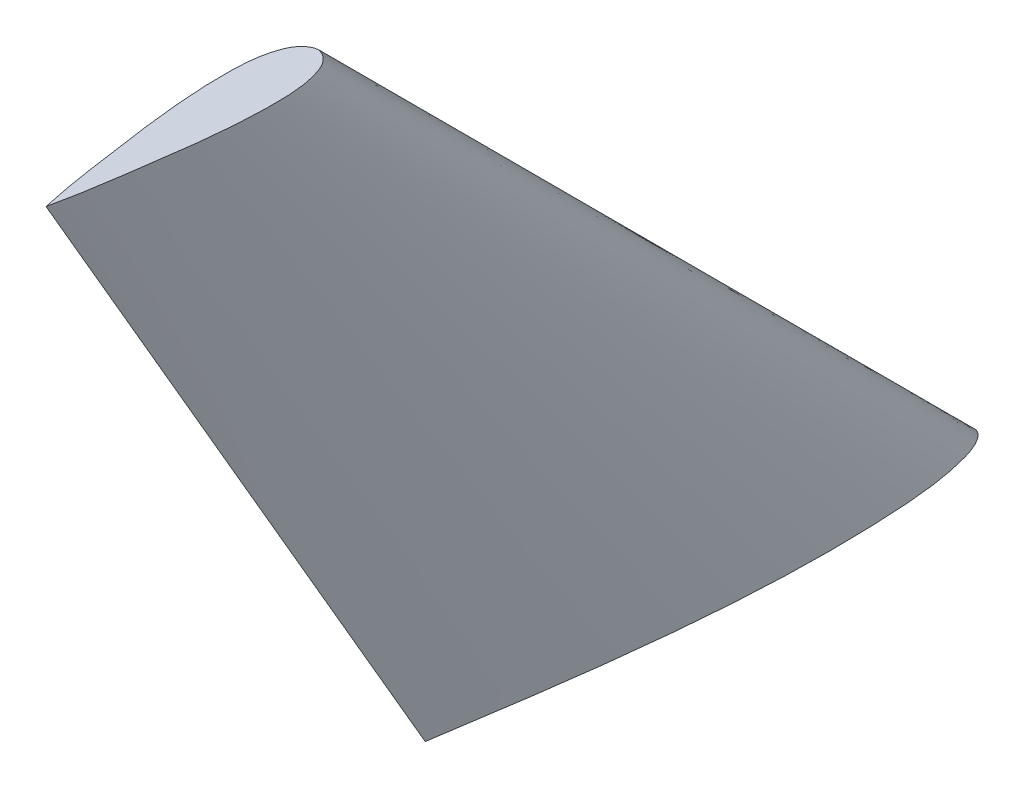
ISO-10303-21;
HEADER;
FILE_DESCRIPTION(('STEP AP214'),'2;1');
FILE_NAME('part.step','',(''),(''),'','','');
FILE_SCHEMA(('AUTOMOTIVE_DESIGN { 1 0 10303 214 1 1 1 1 }'));
ENDSEC;
DATA;
#1=APPLICATION_CONTEXT('core data for automotive mechanical design processes');
#2=APPLICATION_PROTOCOL_DEFINITION('international standard','automotive_design',2000,#1);
#3=PRODUCT_CONTEXT('',#1,'mechanical');
#4=PRODUCT('Part','Part','',(#3));
#5=PRODUCT_RELATED_PRODUCT_CATEGORY('part','',(#4));
#6=PRODUCT_DEFINITION_FORMATION('','',#4);
#7=PRODUCT_DEFINITION_CONTEXT('part definition',#1,'design');
#8=PRODUCT_DEFINITION('design','',#6,#7);
#9=PRODUCT_DEFINITION_SHAPE('','',#8);
#10=(LENGTH_UNIT() NAMED_UNIT(*) SI_UNIT(.MILLI.,.METRE.));
#11=(NAMED_UNIT(*) PLANE_ANGLE_UNIT() SI_UNIT($,.RADIAN.));
#12=(NAMED_UNIT(*) SI_UNIT($,.STERADIAN.) SOLID_ANGLE_UNIT());
#13=UNCERTAINTY_MEASURE_WITH_UNIT(LENGTH_MEASURE(1.E-05),#10,'distance_accuracy_value','');
#14=(GEOMETRIC_REPRESENTATION_CONTEXT(3) GLOBAL_UNCERTAINTY_ASSIGNED_CONTEXT((#13)) GLOBAL_UNIT_ASSIGNED_CONTEXT((#10,
#11,#12)) REPRESENTATION_CONTEXT('',''));
#15=CARTESIAN_POINT('',(0.,0.,0.));
#16=DIRECTION('',(0.,0.,1.));
#17=DIRECTION('',(1.,0.,0.));
#18=AXIS2_PLACEMENT_3D('',#15,#16,#17);
#19=CARTESIAN_POINT('',(-213.384386917728,6473.092464,5068.03850528934));
#20=DIRECTION('',(0.,-1.,0.));
#21=DIRECTION('',(0.,0.,-1.));
#22=AXIS2_PLACEMENT_3D('',#19,#20,#21);
#23=PLANE('',#22);
#24=CARTESIAN_POINT('',(0.,6473.092464,3759.04704469949));
#25=CARTESIAN_POINT('',(-117.183048171368,6473.092464,3780.23513203179));
#26=CARTESIAN_POINT('',(-232.248911785607,6473.092464,4018.31629780731));
#27=CARTESIAN_POINT('',(-275.329646145284,6473.092464,4692.09947457583));
#28=CARTESIAN_POINT('',(-156.144219854721,6473.092464,5521.40296522002));
#29=CARTESIAN_POINT('',(-56.5382481455578,6473.092464,6207.33176473626));
#30=CARTESIAN_POINT('',(0.,6473.092464,6456.16890469949));
#31=B_SPLINE_CURVE_WITH_KNOTS('',3,(#24,#25,#26,#27,#28,#29,#30),.UNSPECIFIED.,.F.,.F.,(4,1,1,1,
4),(0.,0.115121888767725,0.255727856614602,0.72782784492418,1.),.UNSPECIFIED.);
#32=CARTESIAN_POINT('',(0.,6473.092464,3759.04704469949));
#33=VERTEX_POINT('',#32);
#34=CARTESIAN_POINT('',(0.,6473.092464,6456.16890469949));
#35=VERTEX_POINT('',#34);
#36=EDGE_CURVE('E46',#33,#35,#31,.T.);
#37=ORIENTED_EDGE('',*,*,#36,.T.);
#38=CARTESIAN_POINT('',(0.,6473.092464,6456.16890469949));
#39=CARTESIAN_POINT('',(56.5382481455585,6473.092464,6207.33176473626));
#40=CARTESIAN_POINT('',(156.144219854721,6473.092464,5521.40296522001));
#41=CARTESIAN_POINT('',(275.329646145284,6473.092464,4692.09947457584));
#42=CARTESIAN_POINT('',(232.248911785607,6473.092464,4018.31629780731));
#43=CARTESIAN_POINT('',(117.183048171368,6473.092464,3780.23513203179));
#44=CARTESIAN_POINT('',(0.,6473.092464,3759.04704469949));
#45=B_SPLINE_CURVE_WITH_KNOTS('',3,(#38,#39,#40,#41,#42,#43,#44),.UNSPECIFIED.,.F.,.F.,(4,1,1,1,
4),(0.,0.272172155075821,0.744272143385398,0.884878111232275,1.),.UNSPECIFIED.);
#46=EDGE_CURVE('E11',#35,#33,#45,.T.);
#47=ORIENTED_EDGE('',*,*,#46,.T.);
#48=EDGE_LOOP('',(#37,#47));
#49=FACE_BOUND('',#48,.T.);
#50=ADVANCED_FACE('F37',(#49),#23,.F.);
#51=CARTESIAN_POINT('',(-339.108546238725,0.,-59.3161839619755));
#52=DIRECTION('',(0.,-1.,0.));
#53=DIRECTION('',(0.,0.,-1.));
#54=AXIS2_PLACEMENT_3D('',#51,#52,#53);
#55=PLANE('',#54);
#56=CARTESIAN_POINT('',(-9.90906495827807E-13,0.,-2697.12186));
#57=CARTESIAN_POINT('',(-42.9783579589856,0.,-2725.48596752327));
#58=CARTESIAN_POINT('',(-108.384780477141,0.,-2684.86283460844));
#59=CARTESIAN_POINT('',(-190.004634208005,0.,-2564.37525356079));
#60=CARTESIAN_POINT('',(-245.768884065151,0.,-2389.62131410658));
#61=CARTESIAN_POINT('',(-322.337269458174,0.,-2034.39495892719));
#62=CARTESIAN_POINT('',(-456.00265629241,0.,-327.189888099507));
#63=CARTESIAN_POINT('',(-218.351845038458,0.,1297.37661346964));
#64=CARTESIAN_POINT('',(0.,0.,2697.12186));
#65=B_SPLINE_CURVE_WITH_KNOTS('',3,(#56,#57,#58,#59,#60,#61,#62,#63,#64),.UNSPECIFIED.,.F.,.F.,
(4,1,1,1,1,1,4),(0.,0.0216862889820397,0.0376014072760204,0.0786363872485221,0.119260291816199,
0.234392663370427,1.),.UNSPECIFIED.);
#66=CARTESIAN_POINT('',(-9.90906495827807E-13,0.,-2697.12186));
#67=VERTEX_POINT('',#66);
#68=CARTESIAN_POINT('',(0.,0.,2697.12186));
#69=VERTEX_POINT('',#68);
#70=EDGE_CURVE('E68',#67,#69,#65,.T.);
#71=ORIENTED_EDGE('',*,*,#70,.F.);
#72=CARTESIAN_POINT('',(0.,0.,2697.12186));
#73=CARTESIAN_POINT('',(218.351845038457,0.,1297.37661346963));
#74=CARTESIAN_POINT('',(456.00265629241,0.,-327.189888099504));
#75=CARTESIAN_POINT('',(322.337269458173,0.,-2034.39495892719));
#76=CARTESIAN_POINT('',(245.768884065151,0.,-2389.62131410658));
#77=CARTESIAN_POINT('',(190.004634208005,0.,-2564.37525356079));
#78=CARTESIAN_POINT('',(108.384780477141,0.,-2684.86283460844));
#79=CARTESIAN_POINT('',(42.9783579589844,0.,-2725.48596752327));
#80=CARTESIAN_POINT('',(-9.90906495827807E-13,0.,-2697.12186));
#81=B_SPLINE_CURVE_WITH_KNOTS('',3,(#72,#73,#74,#75,#76,#77,#78,#79,#80),.UNSPECIFIED.,.F.,.F.,
(4,1,1,1,1,1,4),(0.,0.765607336629573,0.8807397081838,0.921363612751477,0.962398592723979,
0.97831371101796,1.),.UNSPECIFIED.);
#82=EDGE_CURVE('E71',#69,#67,#81,.T.);
#83=ORIENTED_EDGE('',*,*,#82,.F.);
#84=EDGE_LOOP('',(#71,#83));
#85=FACE_BOUND('',#84,.T.);
#86=ADVANCED_FACE('F75',(#85),#55,.T.);
#87=CARTESIAN_POINT('',(0.,0.,2697.12186));
#88=CARTESIAN_POINT('',(0.,6473.092464,6456.16890469949));
#89=CARTESIAN_POINT('',(77.623723527159,0.,2199.51471586988));
#90=CARTESIAN_POINT('',(56.5382481455585,6473.092464,6207.33176473626));
#91=CARTESIAN_POINT('',(285.824069950016,0.,834.472164692665));
#92=CARTESIAN_POINT('',(156.144219854721,6473.092464,5521.40296522001));
#93=CARTESIAN_POINT('',(397.191938249066,0.,-579.427100948294));
#94=CARTESIAN_POINT('',(259.264904646331,6473.092464,4803.87946828832));
#95=CARTESIAN_POINT('',(348.02853773734,0.,-1706.26017010126));
#96=CARTESIAN_POINT('',(246.211573846967,6473.092464,4239.14452560296));
#97=CARTESIAN_POINT('',(327.630346596136,0.,-1966.79056003058));
#98=CARTESIAN_POINT('',(233.596183757783,6473.092464,4108.91023164634));
#99=CARTESIAN_POINT('',(275.930885266373,0.,-2249.68970007776));
#100=CARTESIAN_POINT('',(191.897217392038,6473.092464,3964.28330940092));
#101=CARTESIAN_POINT('',(243.403756726909,0.,-2397.03314732817));
#102=CARTESIAN_POINT('',(164.966569304315,6473.092464,3888.39115990265));
#103=CARTESIAN_POINT('',(190.004634208005,0.,-2564.37525356079));
#104=CARTESIAN_POINT('',(115.266742264436,6473.092464,3816.34677769169));
#105=CARTESIAN_POINT('',(108.384780477141,0.,-2684.86283460844));
#106=CARTESIAN_POINT('',(56.3262721591304,6473.092464,3775.24968058663));
#107=CARTESIAN_POINT('',(42.9783579589844,0.,-2725.48596752327));
#108=CARTESIAN_POINT('',(22.0745635225634,6473.092464,3763.03838804682));
#109=CARTESIAN_POINT('',(-9.90906495827807E-13,0.,-2697.12186));
#110=CARTESIAN_POINT('',(0.,6473.092464,3759.04704469949));
#111=B_SPLINE_SURFACE_WITH_KNOTS('',3,1,((#87,#88),(#89,#90),(#91,#92),(#93,#94),(#95,#96),(#97,
#98),(#99,#100),(#101,#102),(#103,#104),(#105,#106),(#107,#108),(#109,#110)),.UNSPECIFIED.,.F.,
.F.,.F.,(4,1,1,1,1,1,1,1,1,4),(2,2),(0.,0.272172155075821,0.744272143385398,0.765607336629573,
0.8807397081838,0.884878111232275,0.921363612751477,0.962398592723979,0.97831371101796,1.),(0.,
1.),.UNSPECIFIED.);
#112=DIRECTION('',(0.,0.708031731274927,0.706180619606506));
#113=VECTOR('',#112,1.);
#114=CARTESIAN_POINT('',(-4.95453247913903E-13,3236.546232,530.962592349744));
#115=LINE('',#114,#113);
#116=EDGE_CURVE('E64',#67,#33,#115,.T.);
#117=DIRECTION('',(0.,-0.864761260559115,-0.502183195891908));
#118=VECTOR('',#117,1.);
#119=CARTESIAN_POINT('',(0.,3236.546232,4576.64538234974));
#120=LINE('',#119,#118);
#121=EDGE_CURVE('E53',#35,#69,#120,.T.);
#122=ORIENTED_EDGE('',*,*,#82,.T.);
#123=ORIENTED_EDGE('',*,*,#116,.T.);
#124=ORIENTED_EDGE('',*,*,#46,.F.);
#125=ORIENTED_EDGE('',*,*,#121,.T.);
#126=EDGE_LOOP('',(#122,#123,#124,#125));
#127=FACE_BOUND('',#126,.T.);
#128=ADVANCED_FACE('F72',(#127),#111,.T.);
#129=CARTESIAN_POINT('',(-9.90906495827807E-13,0.,-2697.12186));
#130=CARTESIAN_POINT('',(0.,6473.092464,3759.04704469949));
#131=CARTESIAN_POINT('',(-42.9783579589856,0.,-2725.48596752327));
#132=CARTESIAN_POINT('',(-22.074563522563,6473.092464,3763.03838804682));
#133=CARTESIAN_POINT('',(-108.384780477141,0.,-2684.86283460844));
#134=CARTESIAN_POINT('',(-56.3262721591297,6473.092464,3775.24968058663));
#135=CARTESIAN_POINT('',(-190.004634208005,0.,-2564.37525356079));
#136=CARTESIAN_POINT('',(-115.266742264435,6473.092464,3816.34677769169));
#137=CARTESIAN_POINT('',(-243.403756726909,0.,-2397.03314732817));
#138=CARTESIAN_POINT('',(-164.966569304315,6473.092464,3888.39115990265));
#139=CARTESIAN_POINT('',(-275.930885266373,0.,-2249.68970007776));
#140=CARTESIAN_POINT('',(-191.897217392038,6473.092464,3964.28330940092));
#141=CARTESIAN_POINT('',(-327.630346596136,0.,-1966.79056003058));
#142=CARTESIAN_POINT('',(-233.596183757783,6473.092464,4108.91023164634));
#143=CARTESIAN_POINT('',(-348.02853773734,0.,-1706.26017010126));
#144=CARTESIAN_POINT('',(-246.211573846967,6473.092464,4239.14452560295));
#145=CARTESIAN_POINT('',(-397.191938249066,0.,-579.427100948295));
#146=CARTESIAN_POINT('',(-259.26490464633,6473.092464,4803.87946828832));
#147=CARTESIAN_POINT('',(-285.824069950016,0.,834.472164692672));
#148=CARTESIAN_POINT('',(-156.144219854721,6473.092464,5521.40296522002));
#149=CARTESIAN_POINT('',(-77.6237235271592,0.,2199.51471586989));
#150=CARTESIAN_POINT('',(-56.5382481455578,6473.092464,6207.33176473626));
#151=CARTESIAN_POINT('',(0.,0.,2697.12186));
#152=CARTESIAN_POINT('',(0.,6473.092464,6456.16890469949));
#153=B_SPLINE_SURFACE_WITH_KNOTS('',3,1,((#129,#130),(#131,#132),(#133,#134),(#135,#136),(#137,
#138),(#139,#140),(#141,#142),(#143,#144),(#145,#146),(#147,#148),(#149,#150),(#151,#152)),
.UNSPECIFIED.,.F.,.F.,.F.,(4,1,1,1,1,1,1,1,1,4),(2,2),(0.,0.0216862889820397,0.0376014072760204,
0.0786363872485221,0.115121888767725,0.119260291816199,0.234392663370427,0.255727856614602,
0.72782784492418,1.),(0.,1.),.UNSPECIFIED.);
#154=ORIENTED_EDGE('',*,*,#70,.T.);
#155=ORIENTED_EDGE('',*,*,#121,.F.);
#156=ORIENTED_EDGE('',*,*,#36,.F.);
#157=ORIENTED_EDGE('',*,*,#116,.F.);
#158=EDGE_LOOP('',(#154,#155,#156,#157));
#159=FACE_BOUND('',#158,.T.);
#160=ADVANCED_FACE('F66',(#159),#153,.T.);
#161=CLOSED_SHELL('',(#50,#86,#128,#160));
#162=MANIFOLD_SOLID_BREP('B2',#161);
#163=ADVANCED_BREP_SHAPE_REPRESENTATION('',(#18,#162),#14);
#164=SHAPE_DEFINITION_REPRESENTATION(#9,#163);
ENDSEC;
END-ISO-10303-21;
